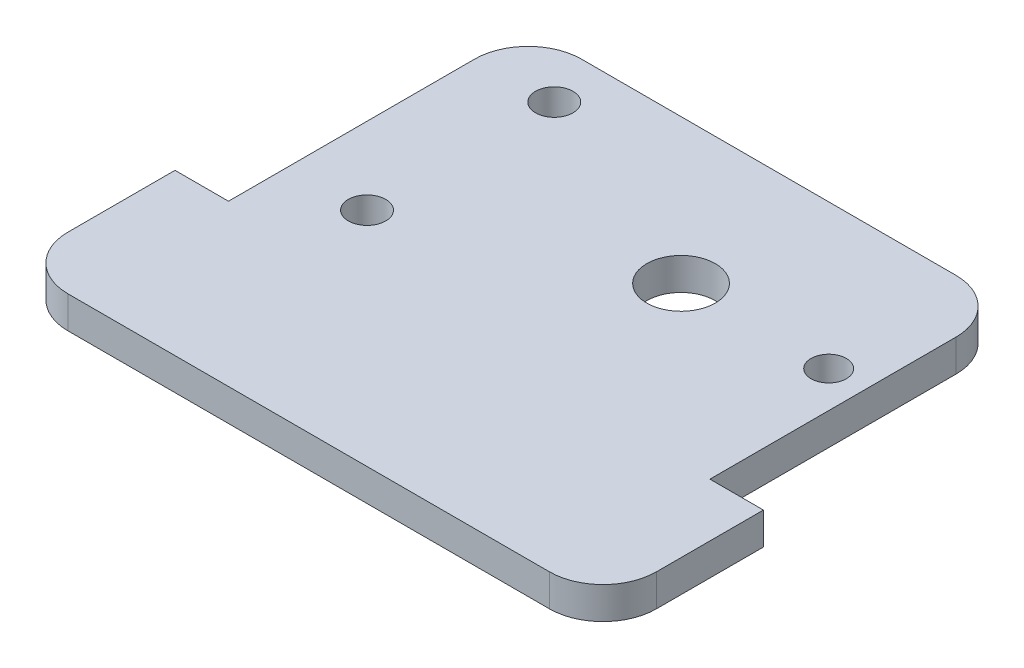
ISO-10303-21;
HEADER;
FILE_DESCRIPTION(('STEP AP214'),'2;1');
FILE_NAME('part.step','',(''),(''),'','','');
FILE_SCHEMA(('AUTOMOTIVE_DESIGN { 1 0 10303 214 1 1 1 1 }'));
ENDSEC;
DATA;
#1=APPLICATION_CONTEXT('core data for automotive mechanical design processes');
#2=APPLICATION_PROTOCOL_DEFINITION('international standard','automotive_design',2000,#1);
#3=PRODUCT_CONTEXT('',#1,'mechanical');
#4=PRODUCT('Part','Part','',(#3));
#5=PRODUCT_RELATED_PRODUCT_CATEGORY('part','',(#4));
#6=PRODUCT_DEFINITION_FORMATION('','',#4);
#7=PRODUCT_DEFINITION_CONTEXT('part definition',#1,'design');
#8=PRODUCT_DEFINITION('design','',#6,#7);
#9=PRODUCT_DEFINITION_SHAPE('','',#8);
#10=(LENGTH_UNIT() NAMED_UNIT(*) SI_UNIT(.MILLI.,.METRE.));
#11=(NAMED_UNIT(*) PLANE_ANGLE_UNIT() SI_UNIT($,.RADIAN.));
#12=(NAMED_UNIT(*) SI_UNIT($,.STERADIAN.) SOLID_ANGLE_UNIT());
#13=UNCERTAINTY_MEASURE_WITH_UNIT(LENGTH_MEASURE(1.E-05),#10,'distance_accuracy_value','');
#14=(GEOMETRIC_REPRESENTATION_CONTEXT(3) GLOBAL_UNCERTAINTY_ASSIGNED_CONTEXT((#13)) GLOBAL_UNIT_ASSIGNED_CONTEXT((#10,
#11,#12)) REPRESENTATION_CONTEXT('',''));
#15=CARTESIAN_POINT('',(0.,0.,0.));
#16=DIRECTION('',(0.,0.,1.));
#17=DIRECTION('',(1.,0.,0.));
#18=AXIS2_PLACEMENT_3D('',#15,#16,#17);
#19=CARTESIAN_POINT('',(0.,3.,14.));
#20=DIRECTION('',(0.,0.,1.));
#21=DIRECTION('',(-1.,0.,0.));
#22=AXIS2_PLACEMENT_3D('',#19,#20,#21);
#23=PLANE('',#22);
#24=DIRECTION('',(1.,0.,0.));
#25=VECTOR('',#24,1.);
#26=CARTESIAN_POINT('',(0.,0.,14.));
#27=LINE('',#26,#25);
#28=CARTESIAN_POINT('',(-27.5,0.,14.));
#29=VERTEX_POINT('',#28);
#30=CARTESIAN_POINT('',(-22.5,0.,14.));
#31=VERTEX_POINT('',#30);
#32=EDGE_CURVE('E194',#29,#31,#27,.T.);
#33=ORIENTED_EDGE('',*,*,#32,.F.);
#34=DIRECTION('',(0.,-1.,0.));
#35=VECTOR('',#34,1.);
#36=CARTESIAN_POINT('',(-27.5,3.,14.));
#37=LINE('',#36,#35);
#38=CARTESIAN_POINT('',(-27.5,3.,14.));
#39=VERTEX_POINT('',#38);
#40=EDGE_CURVE('E154',#39,#29,#37,.T.);
#41=ORIENTED_EDGE('',*,*,#40,.F.);
#42=DIRECTION('',(1.,0.,0.));
#43=VECTOR('',#42,1.);
#44=CARTESIAN_POINT('',(0.,3.,14.));
#45=LINE('',#44,#43);
#46=CARTESIAN_POINT('',(-22.5,3.,14.));
#47=VERTEX_POINT('',#46);
#48=EDGE_CURVE('E134',#39,#47,#45,.T.);
#49=ORIENTED_EDGE('',*,*,#48,.T.);
#50=DIRECTION('',(0.,-1.,0.));
#51=VECTOR('',#50,1.);
#52=CARTESIAN_POINT('',(-22.5,3.,14.));
#53=LINE('',#52,#51);
#54=EDGE_CURVE('E143',#47,#31,#53,.T.);
#55=ORIENTED_EDGE('',*,*,#54,.T.);
#56=EDGE_LOOP('',(#33,#41,#49,#55));
#57=FACE_BOUND('',#56,.T.);
#58=ADVANCED_FACE('F37',(#57),#23,.F.);
#59=CARTESIAN_POINT('',(-22.5,3.,0.));
#60=DIRECTION('',(-1.,0.,0.));
#61=DIRECTION('',(0.,0.,-1.));
#62=AXIS2_PLACEMENT_3D('',#59,#60,#61);
#63=PLANE('',#62);
#64=DIRECTION('',(0.,0.,1.));
#65=VECTOR('',#64,1.);
#66=CARTESIAN_POINT('',(-22.5,0.,0.));
#67=LINE('',#66,#65);
#68=CARTESIAN_POINT('',(-22.5,0.,-9.));
#69=VERTEX_POINT('',#68);
#70=EDGE_CURVE('E146',#69,#31,#67,.T.);
#71=ORIENTED_EDGE('',*,*,#70,.T.);
#72=ORIENTED_EDGE('',*,*,#54,.F.);
#73=DIRECTION('',(0.,0.,1.));
#74=VECTOR('',#73,1.);
#75=CARTESIAN_POINT('',(-22.5,3.,0.));
#76=LINE('',#75,#74);
#77=CARTESIAN_POINT('',(-22.5,3.,-9.));
#78=VERTEX_POINT('',#77);
#79=EDGE_CURVE('E127',#78,#47,#76,.T.);
#80=ORIENTED_EDGE('',*,*,#79,.F.);
#81=DIRECTION('',(0.,-1.,0.));
#82=VECTOR('',#81,1.);
#83=CARTESIAN_POINT('',(-22.5,3.,-9.));
#84=LINE('',#83,#82);
#85=EDGE_CURVE('E246',#69,#78,#84,.F.);
#86=ORIENTED_EDGE('',*,*,#85,.F.);
#87=EDGE_LOOP('',(#71,#72,#80,#86));
#88=FACE_BOUND('',#87,.T.);
#89=ADVANCED_FACE('F144',(#88),#63,.T.);
#90=CARTESIAN_POINT('',(0.,3.,-14.));
#91=DIRECTION('',(0.,0.,1.));
#92=DIRECTION('',(-1.,0.,0.));
#93=AXIS2_PLACEMENT_3D('',#90,#91,#92);
#94=PLANE('',#93);
#95=DIRECTION('',(1.,0.,0.));
#96=VECTOR('',#95,1.);
#97=CARTESIAN_POINT('',(0.,0.,-14.));
#98=LINE('',#97,#96);
#99=CARTESIAN_POINT('',(-17.5,0.,-14.));
#100=VERTEX_POINT('',#99);
#101=CARTESIAN_POINT('',(17.5,0.,-14.));
#102=VERTEX_POINT('',#101);
#103=EDGE_CURVE('E198',#100,#102,#98,.T.);
#104=ORIENTED_EDGE('',*,*,#103,.F.);
#105=DIRECTION('',(0.,-1.,0.));
#106=VECTOR('',#105,1.);
#107=CARTESIAN_POINT('',(-17.5,0.,-14.));
#108=LINE('',#107,#106);
#109=CARTESIAN_POINT('',(-17.5,3.,-14.));
#110=VERTEX_POINT('',#109);
#111=EDGE_CURVE('E235',#110,#100,#108,.T.);
#112=ORIENTED_EDGE('',*,*,#111,.F.);
#113=DIRECTION('',(1.,0.,0.));
#114=VECTOR('',#113,1.);
#115=CARTESIAN_POINT('',(0.,3.,-14.));
#116=LINE('',#115,#114);
#117=CARTESIAN_POINT('',(17.5,3.,-14.));
#118=VERTEX_POINT('',#117);
#119=EDGE_CURVE('E140',#110,#118,#116,.T.);
#120=ORIENTED_EDGE('',*,*,#119,.T.);
#121=DIRECTION('',(0.,-1.,0.));
#122=VECTOR('',#121,1.);
#123=CARTESIAN_POINT('',(17.5,3.,-14.));
#124=LINE('',#123,#122);
#125=EDGE_CURVE('E238',#102,#118,#124,.F.);
#126=ORIENTED_EDGE('',*,*,#125,.F.);
#127=EDGE_LOOP('',(#104,#112,#120,#126));
#128=FACE_BOUND('',#127,.T.);
#129=ADVANCED_FACE('F276',(#128),#94,.F.);
#130=CARTESIAN_POINT('',(22.5,3.,0.));
#131=DIRECTION('',(-1.,0.,0.));
#132=DIRECTION('',(0.,0.,-1.));
#133=AXIS2_PLACEMENT_3D('',#130,#131,#132);
#134=PLANE('',#133);
#135=DIRECTION('',(0.,0.,1.));
#136=VECTOR('',#135,1.);
#137=CARTESIAN_POINT('',(22.5,3.,0.));
#138=LINE('',#137,#136);
#139=CARTESIAN_POINT('',(22.5,3.,-9.));
#140=VERTEX_POINT('',#139);
#141=CARTESIAN_POINT('',(22.5,3.,14.));
#142=VERTEX_POINT('',#141);
#143=EDGE_CURVE('E163',#140,#142,#138,.T.);
#144=ORIENTED_EDGE('',*,*,#143,.T.);
#145=DIRECTION('',(0.,-1.,0.));
#146=VECTOR('',#145,1.);
#147=CARTESIAN_POINT('',(22.5,3.,14.));
#148=LINE('',#147,#146);
#149=CARTESIAN_POINT('',(22.5,0.,14.));
#150=VERTEX_POINT('',#149);
#151=EDGE_CURVE('E151',#142,#150,#148,.T.);
#152=ORIENTED_EDGE('',*,*,#151,.T.);
#153=DIRECTION('',(0.,0.,1.));
#154=VECTOR('',#153,1.);
#155=CARTESIAN_POINT('',(22.5,0.,0.));
#156=LINE('',#155,#154);
#157=CARTESIAN_POINT('',(22.5,0.,-9.));
#158=VERTEX_POINT('',#157);
#159=EDGE_CURVE('E201',#158,#150,#156,.T.);
#160=ORIENTED_EDGE('',*,*,#159,.F.);
#161=DIRECTION('',(0.,-1.,0.));
#162=VECTOR('',#161,1.);
#163=CARTESIAN_POINT('',(22.5,3.,-9.));
#164=LINE('',#163,#162);
#165=EDGE_CURVE('E150',#140,#158,#164,.T.);
#166=ORIENTED_EDGE('',*,*,#165,.F.);
#167=EDGE_LOOP('',(#144,#152,#160,#166));
#168=FACE_BOUND('',#167,.T.);
#169=ADVANCED_FACE('F282',(#168),#134,.F.);
#170=CARTESIAN_POINT('',(27.5,0.,14.));
#171=VERTEX_POINT('',#170);
#172=EDGE_CURVE('E196',#150,#171,#27,.T.);
#173=ORIENTED_EDGE('',*,*,#172,.F.);
#174=ORIENTED_EDGE('',*,*,#151,.F.);
#175=CARTESIAN_POINT('',(27.5,3.,14.));
#176=VERTEX_POINT('',#175);
#177=EDGE_CURVE('E157',#142,#176,#45,.T.);
#178=ORIENTED_EDGE('',*,*,#177,.T.);
#179=DIRECTION('',(0.,-1.,0.));
#180=VECTOR('',#179,1.);
#181=CARTESIAN_POINT('',(27.5,3.,14.));
#182=LINE('',#181,#180);
#183=EDGE_CURVE('E222',#176,#171,#182,.T.);
#184=ORIENTED_EDGE('',*,*,#183,.T.);
#185=EDGE_LOOP('',(#173,#174,#178,#184));
#186=FACE_BOUND('',#185,.T.);
#187=ADVANCED_FACE('F272',(#186),#23,.F.);
#188=CARTESIAN_POINT('',(27.5,3.,0.));
#189=DIRECTION('',(-1.,0.,0.));
#190=DIRECTION('',(0.,0.,-1.));
#191=AXIS2_PLACEMENT_3D('',#188,#189,#190);
#192=PLANE('',#191);
#193=DIRECTION('',(0.,0.,1.));
#194=VECTOR('',#193,1.);
#195=CARTESIAN_POINT('',(27.5,0.,0.));
#196=LINE('',#195,#194);
#197=CARTESIAN_POINT('',(27.5,0.,24.));
#198=VERTEX_POINT('',#197);
#199=EDGE_CURVE('E204',#171,#198,#196,.T.);
#200=ORIENTED_EDGE('',*,*,#199,.F.);
#201=ORIENTED_EDGE('',*,*,#183,.F.);
#202=DIRECTION('',(0.,0.,1.));
#203=VECTOR('',#202,1.);
#204=CARTESIAN_POINT('',(27.5,3.,0.));
#205=LINE('',#204,#203);
#206=CARTESIAN_POINT('',(27.5,3.,24.));
#207=VERTEX_POINT('',#206);
#208=EDGE_CURVE('E162',#176,#207,#205,.T.);
#209=ORIENTED_EDGE('',*,*,#208,.T.);
#210=DIRECTION('',(0.,-1.,0.));
#211=VECTOR('',#210,1.);
#212=CARTESIAN_POINT('',(27.5,3.,24.));
#213=LINE('',#212,#211);
#214=EDGE_CURVE('E11',#198,#207,#213,.F.);
#215=ORIENTED_EDGE('',*,*,#214,.F.);
#216=EDGE_LOOP('',(#200,#201,#209,#215));
#217=FACE_BOUND('',#216,.T.);
#218=ADVANCED_FACE('F281',(#217),#192,.F.);
#219=CARTESIAN_POINT('',(0.,3.,29.));
#220=DIRECTION('',(0.,0.,1.));
#221=DIRECTION('',(-1.,0.,0.));
#222=AXIS2_PLACEMENT_3D('',#219,#220,#221);
#223=PLANE('',#222);
#224=DIRECTION('',(1.,0.,0.));
#225=VECTOR('',#224,1.);
#226=CARTESIAN_POINT('',(0.,0.,29.));
#227=LINE('',#226,#225);
#228=CARTESIAN_POINT('',(-22.5,0.,29.));
#229=VERTEX_POINT('',#228);
#230=CARTESIAN_POINT('',(22.5,0.,29.));
#231=VERTEX_POINT('',#230);
#232=EDGE_CURVE('E207',#229,#231,#227,.T.);
#233=ORIENTED_EDGE('',*,*,#232,.T.);
#234=DIRECTION('',(0.,-1.,0.));
#235=VECTOR('',#234,1.);
#236=CARTESIAN_POINT('',(22.5,0.,29.));
#237=LINE('',#236,#235);
#238=CARTESIAN_POINT('',(22.5,3.,29.));
#239=VERTEX_POINT('',#238);
#240=EDGE_CURVE('E250',#239,#231,#237,.T.);
#241=ORIENTED_EDGE('',*,*,#240,.F.);
#242=DIRECTION('',(1.,0.,0.));
#243=VECTOR('',#242,1.);
#244=CARTESIAN_POINT('',(0.,3.,29.));
#245=LINE('',#244,#243);
#246=CARTESIAN_POINT('',(-22.5,3.,29.));
#247=VERTEX_POINT('',#246);
#248=EDGE_CURVE('E168',#247,#239,#245,.T.);
#249=ORIENTED_EDGE('',*,*,#248,.F.);
#250=DIRECTION('',(0.,-1.,0.));
#251=VECTOR('',#250,1.);
#252=CARTESIAN_POINT('',(-22.5,3.,29.));
#253=LINE('',#252,#251);
#254=EDGE_CURVE('E45',#229,#247,#253,.F.);
#255=ORIENTED_EDGE('',*,*,#254,.F.);
#256=EDGE_LOOP('',(#233,#241,#249,#255));
#257=FACE_BOUND('',#256,.T.);
#258=ADVANCED_FACE('F257',(#257),#223,.T.);
#259=CARTESIAN_POINT('',(-15.3,3.,8.25));
#260=DIRECTION('',(0.,-1.,0.));
#261=DIRECTION('',(0.,0.,1.));
#262=AXIS2_PLACEMENT_3D('',#259,#260,#261);
#263=CYLINDRICAL_SURFACE('',#262,1.75);
#264=CARTESIAN_POINT('',(-15.3,3.,8.25));
#265=DIRECTION('',(0.,-1.,0.));
#266=DIRECTION('',(0.,0.,-1.));
#267=AXIS2_PLACEMENT_3D('',#264,#265,#266);
#268=CIRCLE('',#267,1.75);
#269=CARTESIAN_POINT('',(-15.3,3.,6.5));
#270=VERTEX_POINT('',#269);
#271=EDGE_CURVE('E188',#270,#270,#268,.T.);
#272=ORIENTED_EDGE('',*,*,#271,.F.);
#273=EDGE_LOOP('',(#272));
#274=FACE_BOUND('',#273,.T.);
#275=CARTESIAN_POINT('',(-15.3,0.,8.25));
#276=DIRECTION('',(0.,-1.,0.));
#277=DIRECTION('',(0.,0.,-1.));
#278=AXIS2_PLACEMENT_3D('',#275,#276,#277);
#279=CIRCLE('',#278,1.75);
#280=CARTESIAN_POINT('',(-15.3,0.,6.5));
#281=VERTEX_POINT('',#280);
#282=EDGE_CURVE('E159',#281,#281,#279,.T.);
#283=ORIENTED_EDGE('',*,*,#282,.T.);
#284=EDGE_LOOP('',(#283));
#285=FACE_BOUND('',#284,.T.);
#286=ADVANCED_FACE('F333',(#274,#285),#263,.F.);
#287=CARTESIAN_POINT('',(5.3,3.,-0.499999999999995));
#288=DIRECTION('',(0.,-1.,0.));
#289=DIRECTION('',(0.,0.,1.));
#290=AXIS2_PLACEMENT_3D('',#287,#288,#289);
#291=CYLINDRICAL_SURFACE('',#290,3.2);
#292=CARTESIAN_POINT('',(5.3,3.,-0.499999999999995));
#293=DIRECTION('',(0.,-1.,0.));
#294=DIRECTION('',(0.,0.,-1.));
#295=AXIS2_PLACEMENT_3D('',#292,#293,#294);
#296=CIRCLE('',#295,3.2);
#297=CARTESIAN_POINT('',(5.3,3.,-3.7));
#298=VERTEX_POINT('',#297);
#299=EDGE_CURVE('E185',#298,#298,#296,.T.);
#300=ORIENTED_EDGE('',*,*,#299,.F.);
#301=EDGE_LOOP('',(#300));
#302=FACE_BOUND('',#301,.T.);
#303=CARTESIAN_POINT('',(5.3,0.,-0.499999999999995));
#304=DIRECTION('',(0.,-1.,0.));
#305=DIRECTION('',(0.,0.,-1.));
#306=AXIS2_PLACEMENT_3D('',#303,#304,#305);
#307=CIRCLE('',#306,3.2);
#308=CARTESIAN_POINT('',(5.3,0.,-3.7));
#309=VERTEX_POINT('',#308);
#310=EDGE_CURVE('E216',#309,#309,#307,.T.);
#311=ORIENTED_EDGE('',*,*,#310,.T.);
#312=EDGE_LOOP('',(#311));
#313=FACE_BOUND('',#312,.T.);
#314=ADVANCED_FACE('F342',(#302,#313),#291,.F.);
#315=CARTESIAN_POINT('',(19.1,3.,-0.499999999999994));
#316=DIRECTION('',(0.,-1.,0.));
#317=DIRECTION('',(0.,0.,1.));
#318=AXIS2_PLACEMENT_3D('',#315,#316,#317);
#319=CYLINDRICAL_SURFACE('',#318,1.65);
#320=CARTESIAN_POINT('',(19.1,3.,-0.499999999999994));
#321=DIRECTION('',(0.,-1.,0.));
#322=DIRECTION('',(0.,0.,-1.));
#323=AXIS2_PLACEMENT_3D('',#320,#321,#322);
#324=CIRCLE('',#323,1.65);
#325=CARTESIAN_POINT('',(19.1,3.,-2.14999999999999));
#326=VERTEX_POINT('',#325);
#327=EDGE_CURVE('E182',#326,#326,#324,.T.);
#328=ORIENTED_EDGE('',*,*,#327,.F.);
#329=EDGE_LOOP('',(#328));
#330=FACE_BOUND('',#329,.T.);
#331=CARTESIAN_POINT('',(19.1,0.,-0.499999999999994));
#332=DIRECTION('',(0.,-1.,0.));
#333=DIRECTION('',(0.,0.,-1.));
#334=AXIS2_PLACEMENT_3D('',#331,#332,#333);
#335=CIRCLE('',#334,1.65);
#336=CARTESIAN_POINT('',(19.1,0.,-2.14999999999999));
#337=VERTEX_POINT('',#336);
#338=EDGE_CURVE('E213',#337,#337,#335,.T.);
#339=ORIENTED_EDGE('',*,*,#338,.T.);
#340=EDGE_LOOP('',(#339));
#341=FACE_BOUND('',#340,.T.);
#342=ADVANCED_FACE('F352',(#330,#341),#319,.F.);
#343=CARTESIAN_POINT('',(-27.5,3.,0.));
#344=DIRECTION('',(-1.,0.,0.));
#345=DIRECTION('',(0.,0.,-1.));
#346=AXIS2_PLACEMENT_3D('',#343,#344,#345);
#347=PLANE('',#346);
#348=DIRECTION('',(0.,0.,1.));
#349=VECTOR('',#348,1.);
#350=CARTESIAN_POINT('',(-27.5,3.,0.));
#351=LINE('',#350,#349);
#352=CARTESIAN_POINT('',(-27.5,3.,24.));
#353=VERTEX_POINT('',#352);
#354=EDGE_CURVE('E180',#39,#353,#351,.T.);
#355=ORIENTED_EDGE('',*,*,#354,.F.);
#356=ORIENTED_EDGE('',*,*,#40,.T.);
#357=DIRECTION('',(0.,0.,1.));
#358=VECTOR('',#357,1.);
#359=CARTESIAN_POINT('',(-27.5,0.,0.));
#360=LINE('',#359,#358);
#361=CARTESIAN_POINT('',(-27.5,0.,24.));
#362=VERTEX_POINT('',#361);
#363=EDGE_CURVE('E210',#29,#362,#360,.T.);
#364=ORIENTED_EDGE('',*,*,#363,.T.);
#365=DIRECTION('',(0.,-1.,0.));
#366=VECTOR('',#365,1.);
#367=CARTESIAN_POINT('',(-27.5,3.,24.));
#368=LINE('',#367,#366);
#369=EDGE_CURVE('E248',#353,#362,#368,.T.);
#370=ORIENTED_EDGE('',*,*,#369,.F.);
#371=EDGE_LOOP('',(#355,#356,#364,#370));
#372=FACE_BOUND('',#371,.T.);
#373=ADVANCED_FACE('F259',(#372),#347,.T.);
#374=CARTESIAN_POINT('',(-15.3,3.,-9.25));
#375=DIRECTION('',(0.,-1.,0.));
#376=DIRECTION('',(0.,0.,1.));
#377=AXIS2_PLACEMENT_3D('',#374,#375,#376);
#378=CYLINDRICAL_SURFACE('',#377,1.75);
#379=CARTESIAN_POINT('',(-15.3,3.,-9.25));
#380=DIRECTION('',(0.,-1.,0.));
#381=DIRECTION('',(0.,0.,-1.));
#382=AXIS2_PLACEMENT_3D('',#379,#380,#381);
#383=CIRCLE('',#382,1.75);
#384=CARTESIAN_POINT('',(-15.3,3.,-11.));
#385=VERTEX_POINT('',#384);
#386=EDGE_CURVE('E191',#385,#385,#383,.T.);
#387=ORIENTED_EDGE('',*,*,#386,.F.);
#388=EDGE_LOOP('',(#387));
#389=FACE_BOUND('',#388,.T.);
#390=CARTESIAN_POINT('',(-15.3,0.,-9.25));
#391=DIRECTION('',(0.,-1.,0.));
#392=DIRECTION('',(0.,0.,-1.));
#393=AXIS2_PLACEMENT_3D('',#390,#391,#392);
#394=CIRCLE('',#393,1.75);
#395=CARTESIAN_POINT('',(-15.3,0.,-11.));
#396=VERTEX_POINT('',#395);
#397=EDGE_CURVE('E155',#396,#396,#394,.T.);
#398=ORIENTED_EDGE('',*,*,#397,.T.);
#399=EDGE_LOOP('',(#398));
#400=FACE_BOUND('',#399,.T.);
#401=ADVANCED_FACE('F371',(#389,#400),#378,.F.);
#402=CARTESIAN_POINT('',(0.,3.,0.));
#403=DIRECTION('',(0.,1.,0.));
#404=DIRECTION('',(0.,0.,-1.));
#405=AXIS2_PLACEMENT_3D('',#402,#403,#404);
#406=PLANE('',#405);
#407=ORIENTED_EDGE('',*,*,#119,.F.);
#408=CARTESIAN_POINT('',(-17.5,3.,-9.));
#409=DIRECTION('',(0.,-1.,0.));
#410=DIRECTION('',(0.,0.,-1.));
#411=AXIS2_PLACEMENT_3D('',#408,#409,#410);
#412=CIRCLE('',#411,5.);
#413=EDGE_CURVE('E136',#78,#110,#412,.T.);
#414=ORIENTED_EDGE('',*,*,#413,.F.);
#415=ORIENTED_EDGE('',*,*,#79,.T.);
#416=ORIENTED_EDGE('',*,*,#48,.F.);
#417=ORIENTED_EDGE('',*,*,#354,.T.);
#418=CARTESIAN_POINT('',(-22.5,3.,24.));
#419=DIRECTION('',(0.,-1.,0.));
#420=DIRECTION('',(0.,0.,-1.));
#421=AXIS2_PLACEMENT_3D('',#418,#419,#420);
#422=CIRCLE('',#421,5.);
#423=EDGE_CURVE('E52',#247,#353,#422,.T.);
#424=ORIENTED_EDGE('',*,*,#423,.F.);
#425=ORIENTED_EDGE('',*,*,#248,.T.);
#426=CARTESIAN_POINT('',(22.5,3.,24.));
#427=DIRECTION('',(0.,-1.,0.));
#428=DIRECTION('',(0.,0.,-1.));
#429=AXIS2_PLACEMENT_3D('',#426,#427,#428);
#430=CIRCLE('',#429,5.);
#431=EDGE_CURVE('E59',#207,#239,#430,.T.);
#432=ORIENTED_EDGE('',*,*,#431,.F.);
#433=ORIENTED_EDGE('',*,*,#208,.F.);
#434=ORIENTED_EDGE('',*,*,#177,.F.);
#435=ORIENTED_EDGE('',*,*,#143,.F.);
#436=CARTESIAN_POINT('',(17.5,3.,-9.));
#437=DIRECTION('',(0.,-1.,0.));
#438=DIRECTION('',(0.,0.,-1.));
#439=AXIS2_PLACEMENT_3D('',#436,#437,#438);
#440=CIRCLE('',#439,5.);
#441=EDGE_CURVE('E244',#118,#140,#440,.T.);
#442=ORIENTED_EDGE('',*,*,#441,.F.);
#443=EDGE_LOOP('',(#407,#414,#415,#416,#417,#424,#425,#432,#433,#434,#435,#442));
#444=FACE_BOUND('',#443,.T.);
#445=ORIENTED_EDGE('',*,*,#327,.T.);
#446=EDGE_LOOP('',(#445));
#447=FACE_BOUND('',#446,.T.);
#448=ORIENTED_EDGE('',*,*,#299,.T.);
#449=EDGE_LOOP('',(#448));
#450=FACE_BOUND('',#449,.T.);
#451=ORIENTED_EDGE('',*,*,#271,.T.);
#452=EDGE_LOOP('',(#451));
#453=FACE_BOUND('',#452,.T.);
#454=ORIENTED_EDGE('',*,*,#386,.T.);
#455=EDGE_LOOP('',(#454));
#456=FACE_BOUND('',#455,.T.);
#457=ADVANCED_FACE('F130',(#444,#447,#450,#453,#456),#406,.T.);
#458=CARTESIAN_POINT('',(0.,0.,0.));
#459=DIRECTION('',(0.,1.,0.));
#460=DIRECTION('',(0.,0.,-1.));
#461=AXIS2_PLACEMENT_3D('',#458,#459,#460);
#462=PLANE('',#461);
#463=ORIENTED_EDGE('',*,*,#159,.T.);
#464=ORIENTED_EDGE('',*,*,#172,.T.);
#465=ORIENTED_EDGE('',*,*,#199,.T.);
#466=CARTESIAN_POINT('',(22.5,0.,24.));
#467=DIRECTION('',(0.,-1.,0.));
#468=DIRECTION('',(0.,0.,-1.));
#469=AXIS2_PLACEMENT_3D('',#466,#467,#468);
#470=CIRCLE('',#469,5.);
#471=EDGE_CURVE('E227',#231,#198,#470,.F.);
#472=ORIENTED_EDGE('',*,*,#471,.F.);
#473=ORIENTED_EDGE('',*,*,#232,.F.);
#474=CARTESIAN_POINT('',(-22.5,0.,24.));
#475=DIRECTION('',(0.,-1.,0.));
#476=DIRECTION('',(0.,0.,-1.));
#477=AXIS2_PLACEMENT_3D('',#474,#475,#476);
#478=CIRCLE('',#477,5.);
#479=EDGE_CURVE('E229',#362,#229,#478,.F.);
#480=ORIENTED_EDGE('',*,*,#479,.F.);
#481=ORIENTED_EDGE('',*,*,#363,.F.);
#482=ORIENTED_EDGE('',*,*,#32,.T.);
#483=ORIENTED_EDGE('',*,*,#70,.F.);
#484=CARTESIAN_POINT('',(-17.5,0.,-9.));
#485=DIRECTION('',(0.,-1.,0.));
#486=DIRECTION('',(0.,0.,-1.));
#487=AXIS2_PLACEMENT_3D('',#484,#485,#486);
#488=CIRCLE('',#487,5.);
#489=EDGE_CURVE('E231',#100,#69,#488,.F.);
#490=ORIENTED_EDGE('',*,*,#489,.F.);
#491=ORIENTED_EDGE('',*,*,#103,.T.);
#492=CARTESIAN_POINT('',(17.5,0.,-9.));
#493=DIRECTION('',(0.,-1.,0.));
#494=DIRECTION('',(0.,0.,-1.));
#495=AXIS2_PLACEMENT_3D('',#492,#493,#494);
#496=CIRCLE('',#495,5.);
#497=EDGE_CURVE('E233',#158,#102,#496,.F.);
#498=ORIENTED_EDGE('',*,*,#497,.F.);
#499=EDGE_LOOP('',(#463,#464,#465,#472,#473,#480,#481,#482,#483,#490,#491,#498));
#500=FACE_BOUND('',#499,.T.);
#501=ORIENTED_EDGE('',*,*,#338,.F.);
#502=EDGE_LOOP('',(#501));
#503=FACE_BOUND('',#502,.T.);
#504=ORIENTED_EDGE('',*,*,#310,.F.);
#505=EDGE_LOOP('',(#504));
#506=FACE_BOUND('',#505,.T.);
#507=ORIENTED_EDGE('',*,*,#282,.F.);
#508=EDGE_LOOP('',(#507));
#509=FACE_BOUND('',#508,.T.);
#510=ORIENTED_EDGE('',*,*,#397,.F.);
#511=EDGE_LOOP('',(#510));
#512=FACE_BOUND('',#511,.T.);
#513=ADVANCED_FACE('F261',(#500,#503,#506,#509,#512),#462,.F.);
#514=CARTESIAN_POINT('',(17.5,3.,-9.));
#515=DIRECTION('',(0.,-1.,0.));
#516=DIRECTION('',(0.,0.,1.));
#517=AXIS2_PLACEMENT_3D('',#514,#515,#516);
#518=CYLINDRICAL_SURFACE('',#517,5.);
#519=ORIENTED_EDGE('',*,*,#441,.T.);
#520=ORIENTED_EDGE('',*,*,#165,.T.);
#521=ORIENTED_EDGE('',*,*,#497,.T.);
#522=ORIENTED_EDGE('',*,*,#125,.T.);
#523=EDGE_LOOP('',(#519,#520,#521,#522));
#524=FACE_BOUND('',#523,.T.);
#525=ADVANCED_FACE('F293',(#524),#518,.T.);
#526=CARTESIAN_POINT('',(-17.5,3.,-9.));
#527=DIRECTION('',(0.,1.,0.));
#528=DIRECTION('',(0.,0.,-1.));
#529=AXIS2_PLACEMENT_3D('',#526,#527,#528);
#530=CYLINDRICAL_SURFACE('',#529,5.);
#531=ORIENTED_EDGE('',*,*,#413,.T.);
#532=ORIENTED_EDGE('',*,*,#111,.T.);
#533=ORIENTED_EDGE('',*,*,#489,.T.);
#534=ORIENTED_EDGE('',*,*,#85,.T.);
#535=EDGE_LOOP('',(#531,#532,#533,#534));
#536=FACE_BOUND('',#535,.T.);
#537=ADVANCED_FACE('F269',(#536),#530,.T.);
#538=CARTESIAN_POINT('',(-22.5,3.,24.));
#539=DIRECTION('',(0.,-1.,0.));
#540=DIRECTION('',(0.,0.,1.));
#541=AXIS2_PLACEMENT_3D('',#538,#539,#540);
#542=CYLINDRICAL_SURFACE('',#541,5.);
#543=ORIENTED_EDGE('',*,*,#423,.T.);
#544=ORIENTED_EDGE('',*,*,#369,.T.);
#545=ORIENTED_EDGE('',*,*,#479,.T.);
#546=ORIENTED_EDGE('',*,*,#254,.T.);
#547=EDGE_LOOP('',(#543,#544,#545,#546));
#548=FACE_BOUND('',#547,.T.);
#549=ADVANCED_FACE('F253',(#548),#542,.T.);
#550=CARTESIAN_POINT('',(22.5,3.,24.));
#551=DIRECTION('',(0.,1.,0.));
#552=DIRECTION('',(0.,0.,-1.));
#553=AXIS2_PLACEMENT_3D('',#550,#551,#552);
#554=CYLINDRICAL_SURFACE('',#553,5.);
#555=ORIENTED_EDGE('',*,*,#431,.T.);
#556=ORIENTED_EDGE('',*,*,#240,.T.);
#557=ORIENTED_EDGE('',*,*,#471,.T.);
#558=ORIENTED_EDGE('',*,*,#214,.T.);
#559=EDGE_LOOP('',(#555,#556,#557,#558));
#560=FACE_BOUND('',#559,.T.);
#561=ADVANCED_FACE('F39',(#560),#554,.T.);
#562=CLOSED_SHELL('',(#58,#89,#129,#169,#187,#218,#258,#286,#314,#342,#373,#401,#457,#513,#525,
#537,#549,#561));
#563=MANIFOLD_SOLID_BREP('B2',#562);
#564=ADVANCED_BREP_SHAPE_REPRESENTATION('',(#18,#563),#14);
#565=SHAPE_DEFINITION_REPRESENTATION(#9,#564);
ENDSEC;
END-ISO-10303-21;
